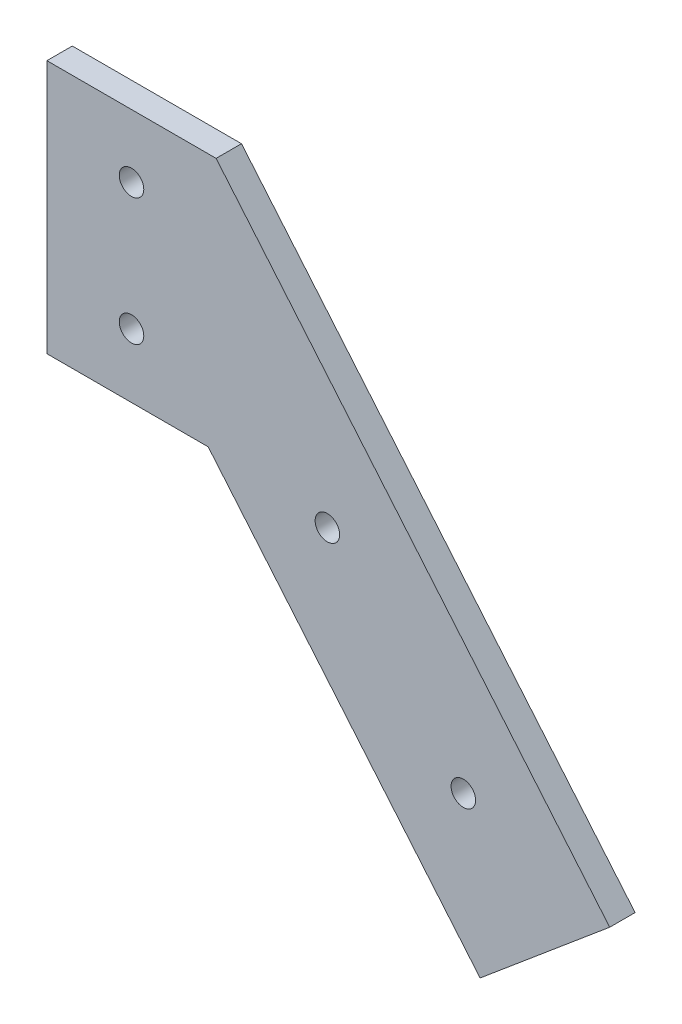
ISO-10303-21;
HEADER;
FILE_DESCRIPTION(('STEP AP214'),'2;1');
FILE_NAME('part.step','',(''),(''),'','','');
FILE_SCHEMA(('AUTOMOTIVE_DESIGN { 1 0 10303 214 1 1 1 1 }'));
ENDSEC;
DATA;
#1=APPLICATION_CONTEXT('core data for automotive mechanical design processes');
#2=APPLICATION_PROTOCOL_DEFINITION('international standard','automotive_design',2000,#1);
#3=PRODUCT_CONTEXT('',#1,'mechanical');
#4=PRODUCT('Part','Part','',(#3));
#5=PRODUCT_RELATED_PRODUCT_CATEGORY('part','',(#4));
#6=PRODUCT_DEFINITION_FORMATION('','',#4);
#7=PRODUCT_DEFINITION_CONTEXT('part definition',#1,'design');
#8=PRODUCT_DEFINITION('design','',#6,#7);
#9=PRODUCT_DEFINITION_SHAPE('','',#8);
#10=(LENGTH_UNIT() NAMED_UNIT(*) SI_UNIT(.MILLI.,.METRE.));
#11=(NAMED_UNIT(*) PLANE_ANGLE_UNIT() SI_UNIT($,.RADIAN.));
#12=(NAMED_UNIT(*) SI_UNIT($,.STERADIAN.) SOLID_ANGLE_UNIT());
#13=UNCERTAINTY_MEASURE_WITH_UNIT(LENGTH_MEASURE(1.E-05),#10,'distance_accuracy_value','');
#14=(GEOMETRIC_REPRESENTATION_CONTEXT(3) GLOBAL_UNCERTAINTY_ASSIGNED_CONTEXT((#13)) GLOBAL_UNIT_ASSIGNED_CONTEXT((#10,
#11,#12)) REPRESENTATION_CONTEXT('',''));
#15=CARTESIAN_POINT('',(0.,0.,0.));
#16=DIRECTION('',(0.,0.,1.));
#17=DIRECTION('',(1.,0.,0.));
#18=AXIS2_PLACEMENT_3D('',#15,#16,#17);
#19=CARTESIAN_POINT('',(0.,0.,3.));
#20=DIRECTION('',(0.,0.,1.));
#21=DIRECTION('',(1.,0.,0.));
#22=AXIS2_PLACEMENT_3D('',#19,#20,#21);
#23=PLANE('',#22);
#24=CARTESIAN_POINT('',(49.2228539188914,-50.3836794122989,3.));
#25=DIRECTION('',(0.,0.,1.));
#26=DIRECTION('',(1.,0.,0.));
#27=AXIS2_PLACEMENT_3D('',#24,#25,#26);
#28=CIRCLE('',#27,1.45);
#29=CARTESIAN_POINT('',(50.6728539188914,-50.3836794122989,3.));
#30=VERTEX_POINT('',#29);
#31=EDGE_CURVE('E189',#30,#30,#28,.T.);
#32=ORIENTED_EDGE('',*,*,#31,.F.);
#33=EDGE_LOOP('',(#32));
#34=FACE_BOUND('',#33,.T.);
#35=CARTESIAN_POINT('',(10.,-7.45165514518306,3.));
#36=DIRECTION('',(0.,0.,1.));
#37=DIRECTION('',(1.,0.,0.));
#38=AXIS2_PLACEMENT_3D('',#35,#36,#37);
#39=CIRCLE('',#38,1.45);
#40=CARTESIAN_POINT('',(11.45,-7.45165514518306,3.));
#41=VERTEX_POINT('',#40);
#42=EDGE_CURVE('E122',#41,#41,#39,.T.);
#43=ORIENTED_EDGE('',*,*,#42,.F.);
#44=EDGE_LOOP('',(#43));
#45=FACE_BOUND('',#44,.T.);
#46=DIRECTION('',(0.,-1.,0.));
#47=VECTOR('',#46,1.);
#48=CARTESIAN_POINT('',(0.,0.,3.));
#49=LINE('',#48,#47);
#50=CARTESIAN_POINT('',(0.,0.,3.));
#51=VERTEX_POINT('',#50);
#52=CARTESIAN_POINT('',(0.,-30.,3.));
#53=VERTEX_POINT('',#52);
#54=EDGE_CURVE('E129',#51,#53,#49,.T.);
#55=ORIENTED_EDGE('',*,*,#54,.T.);
#56=DIRECTION('',(1.,0.,0.));
#57=VECTOR('',#56,1.);
#58=CARTESIAN_POINT('',(0.,-30.,3.));
#59=LINE('',#58,#57);
#60=CARTESIAN_POINT('',(19.0648431486728,-30.,3.));
#61=VERTEX_POINT('',#60);
#62=EDGE_CURVE('E87',#53,#61,#59,.T.);
#63=ORIENTED_EDGE('',*,*,#62,.T.);
#64=DIRECTION('',(0.642787609686538,-0.766044443118979,0.));
#65=VECTOR('',#64,1.);
#66=CARTESIAN_POINT('',(19.0648431486728,-30.,3.));
#67=LINE('',#66,#65);
#68=CARTESIAN_POINT('',(51.2042236329997,-68.302222155949,3.));
#69=VERTEX_POINT('',#68);
#70=EDGE_CURVE('E100',#61,#69,#67,.T.);
#71=ORIENTED_EDGE('',*,*,#70,.T.);
#72=DIRECTION('',(0.766044443118979,0.642787609686538,0.));
#73=VECTOR('',#72,1.);
#74=CARTESIAN_POINT('',(51.2042236329997,-68.302222155949,3.));
#75=LINE('',#74,#73);
#76=CARTESIAN_POINT('',(66.5251124953792,-55.4464699622182,3.));
#77=VERTEX_POINT('',#76);
#78=EDGE_CURVE('E94',#69,#77,#75,.T.);
#79=ORIENTED_EDGE('',*,*,#78,.T.);
#80=DIRECTION('',(-0.642787609686538,0.766044443118979,0.));
#81=VECTOR('',#80,1.);
#82=CARTESIAN_POINT('',(20.,0.,3.));
#83=LINE('',#82,#81);
#84=CARTESIAN_POINT('',(20.,0.,3.));
#85=VERTEX_POINT('',#84);
#86=EDGE_CURVE('E98',#77,#85,#83,.T.);
#87=ORIENTED_EDGE('',*,*,#86,.T.);
#88=DIRECTION('',(-1.,0.,0.));
#89=VECTOR('',#88,1.);
#90=CARTESIAN_POINT('',(0.,0.,3.));
#91=LINE('',#90,#89);
#92=EDGE_CURVE('E50',#85,#51,#91,.T.);
#93=ORIENTED_EDGE('',*,*,#92,.T.);
#94=EDGE_LOOP('',(#55,#63,#71,#79,#87,#93));
#95=FACE_BOUND('',#94,.T.);
#96=CARTESIAN_POINT('',(10.,-22.4516551451831,3.));
#97=DIRECTION('',(0.,0.,1.));
#98=DIRECTION('',(1.,0.,0.));
#99=AXIS2_PLACEMENT_3D('',#96,#97,#98);
#100=CIRCLE('',#99,1.45);
#101=CARTESIAN_POINT('',(11.45,-22.4516551451831,3.));
#102=VERTEX_POINT('',#101);
#103=EDGE_CURVE('E195',#102,#102,#100,.T.);
#104=ORIENTED_EDGE('',*,*,#103,.F.);
#105=EDGE_LOOP('',(#104));
#106=FACE_BOUND('',#105,.T.);
#107=CARTESIAN_POINT('',(33.1531636767279,-31.2325683343244,3.));
#108=DIRECTION('',(0.,0.,1.));
#109=DIRECTION('',(1.,0.,0.));
#110=AXIS2_PLACEMENT_3D('',#107,#108,#109);
#111=CIRCLE('',#110,1.45);
#112=CARTESIAN_POINT('',(34.6031636767279,-31.2325683343244,3.));
#113=VERTEX_POINT('',#112);
#114=EDGE_CURVE('E180',#113,#113,#111,.T.);
#115=ORIENTED_EDGE('',*,*,#114,.F.);
#116=EDGE_LOOP('',(#115));
#117=FACE_BOUND('',#116,.T.);
#118=ADVANCED_FACE('F33',(#34,#45,#95,#106,#117),#23,.T.);
#119=CARTESIAN_POINT('',(0.,0.,0.));
#120=DIRECTION('',(0.,0.,1.));
#121=DIRECTION('',(1.,0.,0.));
#122=AXIS2_PLACEMENT_3D('',#119,#120,#121);
#123=PLANE('',#122);
#124=DIRECTION('',(0.,-1.,0.));
#125=VECTOR('',#124,1.);
#126=CARTESIAN_POINT('',(0.,0.,0.));
#127=LINE('',#126,#125);
#128=CARTESIAN_POINT('',(0.,0.,0.));
#129=VERTEX_POINT('',#128);
#130=CARTESIAN_POINT('',(0.,-30.,0.));
#131=VERTEX_POINT('',#130);
#132=EDGE_CURVE('E118',#129,#131,#127,.T.);
#133=ORIENTED_EDGE('',*,*,#132,.F.);
#134=DIRECTION('',(-1.,0.,0.));
#135=VECTOR('',#134,1.);
#136=CARTESIAN_POINT('',(0.,0.,0.));
#137=LINE('',#136,#135);
#138=CARTESIAN_POINT('',(20.,0.,0.));
#139=VERTEX_POINT('',#138);
#140=EDGE_CURVE('E79',#139,#129,#137,.T.);
#141=ORIENTED_EDGE('',*,*,#140,.F.);
#142=DIRECTION('',(-0.642787609686538,0.766044443118979,0.));
#143=VECTOR('',#142,1.);
#144=CARTESIAN_POINT('',(20.,0.,0.));
#145=LINE('',#144,#143);
#146=CARTESIAN_POINT('',(66.5251124953792,-55.4464699622182,0.));
#147=VERTEX_POINT('',#146);
#148=EDGE_CURVE('E73',#147,#139,#145,.T.);
#149=ORIENTED_EDGE('',*,*,#148,.F.);
#150=DIRECTION('',(0.766044443118979,0.642787609686538,0.));
#151=VECTOR('',#150,1.);
#152=CARTESIAN_POINT('',(51.2042236329997,-68.302222155949,0.));
#153=LINE('',#152,#151);
#154=CARTESIAN_POINT('',(51.2042236329997,-68.302222155949,0.));
#155=VERTEX_POINT('',#154);
#156=EDGE_CURVE('E108',#155,#147,#153,.T.);
#157=ORIENTED_EDGE('',*,*,#156,.F.);
#158=DIRECTION('',(0.642787609686538,-0.766044443118979,0.));
#159=VECTOR('',#158,1.);
#160=CARTESIAN_POINT('',(19.0648431486728,-30.,0.));
#161=LINE('',#160,#159);
#162=CARTESIAN_POINT('',(19.0648431486728,-30.,0.));
#163=VERTEX_POINT('',#162);
#164=EDGE_CURVE('E124',#163,#155,#161,.T.);
#165=ORIENTED_EDGE('',*,*,#164,.F.);
#166=DIRECTION('',(1.,0.,0.));
#167=VECTOR('',#166,1.);
#168=CARTESIAN_POINT('',(0.,-30.,0.));
#169=LINE('',#168,#167);
#170=EDGE_CURVE('E121',#131,#163,#169,.T.);
#171=ORIENTED_EDGE('',*,*,#170,.F.);
#172=EDGE_LOOP('',(#133,#141,#149,#157,#165,#171));
#173=FACE_BOUND('',#172,.T.);
#174=CARTESIAN_POINT('',(10.,-7.45165514518306,0.));
#175=DIRECTION('',(0.,0.,1.));
#176=DIRECTION('',(1.,0.,0.));
#177=AXIS2_PLACEMENT_3D('',#174,#175,#176);
#178=CIRCLE('',#177,1.45);
#179=CARTESIAN_POINT('',(11.45,-7.45165514518306,0.));
#180=VERTEX_POINT('',#179);
#181=EDGE_CURVE('E198',#180,#180,#178,.T.);
#182=ORIENTED_EDGE('',*,*,#181,.T.);
#183=EDGE_LOOP('',(#182));
#184=FACE_BOUND('',#183,.T.);
#185=CARTESIAN_POINT('',(10.,-22.4516551451831,0.));
#186=DIRECTION('',(0.,0.,1.));
#187=DIRECTION('',(1.,0.,0.));
#188=AXIS2_PLACEMENT_3D('',#185,#186,#187);
#189=CIRCLE('',#188,1.45);
#190=CARTESIAN_POINT('',(11.45,-22.4516551451831,0.));
#191=VERTEX_POINT('',#190);
#192=EDGE_CURVE('E192',#191,#191,#189,.T.);
#193=ORIENTED_EDGE('',*,*,#192,.T.);
#194=EDGE_LOOP('',(#193));
#195=FACE_BOUND('',#194,.T.);
#196=CARTESIAN_POINT('',(49.2228539188914,-50.3836794122989,0.));
#197=DIRECTION('',(0.,0.,1.));
#198=DIRECTION('',(1.,0.,0.));
#199=AXIS2_PLACEMENT_3D('',#196,#197,#198);
#200=CIRCLE('',#199,1.45);
#201=CARTESIAN_POINT('',(50.6728539188914,-50.3836794122989,0.));
#202=VERTEX_POINT('',#201);
#203=EDGE_CURVE('E186',#202,#202,#200,.T.);
#204=ORIENTED_EDGE('',*,*,#203,.T.);
#205=EDGE_LOOP('',(#204));
#206=FACE_BOUND('',#205,.T.);
#207=CARTESIAN_POINT('',(33.1531636767279,-31.2325683343244,0.));
#208=DIRECTION('',(0.,0.,1.));
#209=DIRECTION('',(1.,0.,0.));
#210=AXIS2_PLACEMENT_3D('',#207,#208,#209);
#211=CIRCLE('',#210,1.45);
#212=CARTESIAN_POINT('',(34.6031636767279,-31.2325683343244,0.));
#213=VERTEX_POINT('',#212);
#214=EDGE_CURVE('E183',#213,#213,#211,.T.);
#215=ORIENTED_EDGE('',*,*,#214,.T.);
#216=EDGE_LOOP('',(#215));
#217=FACE_BOUND('',#216,.T.);
#218=ADVANCED_FACE('F138',(#173,#184,#195,#206,#217),#123,.F.);
#219=CARTESIAN_POINT('',(0.,0.,3.));
#220=DIRECTION('',(1.,0.,0.));
#221=DIRECTION('',(0.,1.,0.));
#222=AXIS2_PLACEMENT_3D('',#219,#220,#221);
#223=PLANE('',#222);
#224=ORIENTED_EDGE('',*,*,#132,.T.);
#225=DIRECTION('',(0.,0.,-1.));
#226=VECTOR('',#225,1.);
#227=CARTESIAN_POINT('',(0.,-30.,3.));
#228=LINE('',#227,#226);
#229=EDGE_CURVE('E11',#53,#131,#228,.T.);
#230=ORIENTED_EDGE('',*,*,#229,.F.);
#231=ORIENTED_EDGE('',*,*,#54,.F.);
#232=DIRECTION('',(0.,0.,-1.));
#233=VECTOR('',#232,1.);
#234=CARTESIAN_POINT('',(0.,0.,3.));
#235=LINE('',#234,#233);
#236=EDGE_CURVE('E114',#51,#129,#235,.T.);
#237=ORIENTED_EDGE('',*,*,#236,.T.);
#238=EDGE_LOOP('',(#224,#230,#231,#237));
#239=FACE_BOUND('',#238,.T.);
#240=ADVANCED_FACE('F35',(#239),#223,.F.);
#241=CARTESIAN_POINT('',(0.,-30.,3.));
#242=DIRECTION('',(0.,1.,0.));
#243=DIRECTION('',(0.,0.,1.));
#244=AXIS2_PLACEMENT_3D('',#241,#242,#243);
#245=PLANE('',#244);
#246=ORIENTED_EDGE('',*,*,#170,.T.);
#247=DIRECTION('',(0.,0.,-1.));
#248=VECTOR('',#247,1.);
#249=CARTESIAN_POINT('',(19.0648431486728,-30.,3.));
#250=LINE('',#249,#248);
#251=EDGE_CURVE('E42',#61,#163,#250,.T.);
#252=ORIENTED_EDGE('',*,*,#251,.F.);
#253=ORIENTED_EDGE('',*,*,#62,.F.);
#254=ORIENTED_EDGE('',*,*,#229,.T.);
#255=EDGE_LOOP('',(#246,#252,#253,#254));
#256=FACE_BOUND('',#255,.T.);
#257=ADVANCED_FACE('F256',(#256),#245,.F.);
#258=CARTESIAN_POINT('',(19.0648431486728,-30.,3.));
#259=DIRECTION('',(0.766044443118979,0.642787609686538,0.));
#260=DIRECTION('',(-0.642787609686538,0.766044443118979,0.));
#261=AXIS2_PLACEMENT_3D('',#258,#259,#260);
#262=PLANE('',#261);
#263=ORIENTED_EDGE('',*,*,#164,.T.);
#264=DIRECTION('',(0.,0.,-1.));
#265=VECTOR('',#264,1.);
#266=CARTESIAN_POINT('',(51.2042236329997,-68.302222155949,3.));
#267=LINE('',#266,#265);
#268=EDGE_CURVE('E109',#69,#155,#267,.T.);
#269=ORIENTED_EDGE('',*,*,#268,.F.);
#270=ORIENTED_EDGE('',*,*,#70,.F.);
#271=ORIENTED_EDGE('',*,*,#251,.T.);
#272=EDGE_LOOP('',(#263,#269,#270,#271));
#273=FACE_BOUND('',#272,.T.);
#274=ADVANCED_FACE('F135',(#273),#262,.F.);
#275=CARTESIAN_POINT('',(51.2042236329997,-68.302222155949,3.));
#276=DIRECTION('',(-0.642787609686538,0.766044443118979,0.));
#277=DIRECTION('',(-0.766044443118979,-0.642787609686538,0.));
#278=AXIS2_PLACEMENT_3D('',#275,#276,#277);
#279=PLANE('',#278);
#280=ORIENTED_EDGE('',*,*,#156,.T.);
#281=DIRECTION('',(0.,0.,-1.));
#282=VECTOR('',#281,1.);
#283=CARTESIAN_POINT('',(66.5251124953792,-55.4464699622182,3.));
#284=LINE('',#283,#282);
#285=EDGE_CURVE('E105',#77,#147,#284,.T.);
#286=ORIENTED_EDGE('',*,*,#285,.F.);
#287=ORIENTED_EDGE('',*,*,#78,.F.);
#288=ORIENTED_EDGE('',*,*,#268,.T.);
#289=EDGE_LOOP('',(#280,#286,#287,#288));
#290=FACE_BOUND('',#289,.T.);
#291=ADVANCED_FACE('F106',(#290),#279,.F.);
#292=CARTESIAN_POINT('',(20.,0.,3.));
#293=DIRECTION('',(-0.766044443118979,-0.642787609686538,0.));
#294=DIRECTION('',(0.642787609686538,-0.766044443118979,0.));
#295=AXIS2_PLACEMENT_3D('',#292,#293,#294);
#296=PLANE('',#295);
#297=ORIENTED_EDGE('',*,*,#148,.T.);
#298=DIRECTION('',(0.,0.,-1.));
#299=VECTOR('',#298,1.);
#300=CARTESIAN_POINT('',(20.,0.,3.));
#301=LINE('',#300,#299);
#302=EDGE_CURVE('E110',#85,#139,#301,.T.);
#303=ORIENTED_EDGE('',*,*,#302,.F.);
#304=ORIENTED_EDGE('',*,*,#86,.F.);
#305=ORIENTED_EDGE('',*,*,#285,.T.);
#306=EDGE_LOOP('',(#297,#303,#304,#305));
#307=FACE_BOUND('',#306,.T.);
#308=ADVANCED_FACE('F112',(#307),#296,.F.);
#309=CARTESIAN_POINT('',(0.,0.,3.));
#310=DIRECTION('',(0.,-1.,0.));
#311=DIRECTION('',(0.,0.,-1.));
#312=AXIS2_PLACEMENT_3D('',#309,#310,#311);
#313=PLANE('',#312);
#314=ORIENTED_EDGE('',*,*,#140,.T.);
#315=ORIENTED_EDGE('',*,*,#236,.F.);
#316=ORIENTED_EDGE('',*,*,#92,.F.);
#317=ORIENTED_EDGE('',*,*,#302,.T.);
#318=EDGE_LOOP('',(#314,#315,#316,#317));
#319=FACE_BOUND('',#318,.T.);
#320=ADVANCED_FACE('F143',(#319),#313,.F.);
#321=CARTESIAN_POINT('',(10.,-7.45165514518306,3.));
#322=DIRECTION('',(0.,0.,-1.));
#323=DIRECTION('',(-1.,0.,0.));
#324=AXIS2_PLACEMENT_3D('',#321,#322,#323);
#325=CYLINDRICAL_SURFACE('',#324,1.45);
#326=ORIENTED_EDGE('',*,*,#42,.T.);
#327=EDGE_LOOP('',(#326));
#328=FACE_BOUND('',#327,.T.);
#329=ORIENTED_EDGE('',*,*,#181,.F.);
#330=EDGE_LOOP('',(#329));
#331=FACE_BOUND('',#330,.T.);
#332=ADVANCED_FACE('F145',(#328,#331),#325,.F.);
#333=CARTESIAN_POINT('',(10.,-22.4516551451831,3.));
#334=DIRECTION('',(0.,0.,-1.));
#335=DIRECTION('',(-1.,0.,0.));
#336=AXIS2_PLACEMENT_3D('',#333,#334,#335);
#337=CYLINDRICAL_SURFACE('',#336,1.45);
#338=ORIENTED_EDGE('',*,*,#103,.T.);
#339=EDGE_LOOP('',(#338));
#340=FACE_BOUND('',#339,.T.);
#341=ORIENTED_EDGE('',*,*,#192,.F.);
#342=EDGE_LOOP('',(#341));
#343=FACE_BOUND('',#342,.T.);
#344=ADVANCED_FACE('F151',(#340,#343),#337,.F.);
#345=CARTESIAN_POINT('',(49.2228539188914,-50.3836794122989,3.));
#346=DIRECTION('',(0.,0.,-1.));
#347=DIRECTION('',(-1.,0.,0.));
#348=AXIS2_PLACEMENT_3D('',#345,#346,#347);
#349=CYLINDRICAL_SURFACE('',#348,1.45);
#350=ORIENTED_EDGE('',*,*,#31,.T.);
#351=EDGE_LOOP('',(#350));
#352=FACE_BOUND('',#351,.T.);
#353=ORIENTED_EDGE('',*,*,#203,.F.);
#354=EDGE_LOOP('',(#353));
#355=FACE_BOUND('',#354,.T.);
#356=ADVANCED_FACE('F167',(#352,#355),#349,.F.);
#357=CARTESIAN_POINT('',(33.1531636767279,-31.2325683343244,3.));
#358=DIRECTION('',(0.,0.,-1.));
#359=DIRECTION('',(-1.,0.,0.));
#360=AXIS2_PLACEMENT_3D('',#357,#358,#359);
#361=CYLINDRICAL_SURFACE('',#360,1.45);
#362=ORIENTED_EDGE('',*,*,#114,.T.);
#363=EDGE_LOOP('',(#362));
#364=FACE_BOUND('',#363,.T.);
#365=ORIENTED_EDGE('',*,*,#214,.F.);
#366=EDGE_LOOP('',(#365));
#367=FACE_BOUND('',#366,.T.);
#368=ADVANCED_FACE('F171',(#364,#367),#361,.F.);
#369=CLOSED_SHELL('',(#118,#218,#240,#257,#274,#291,#308,#320,#332,#344,#356,#368));
#370=MANIFOLD_SOLID_BREP('B2',#369);
#371=ADVANCED_BREP_SHAPE_REPRESENTATION('',(#18,#370),#14);
#372=SHAPE_DEFINITION_REPRESENTATION(#9,#371);
ENDSEC;
END-ISO-10303-21;
